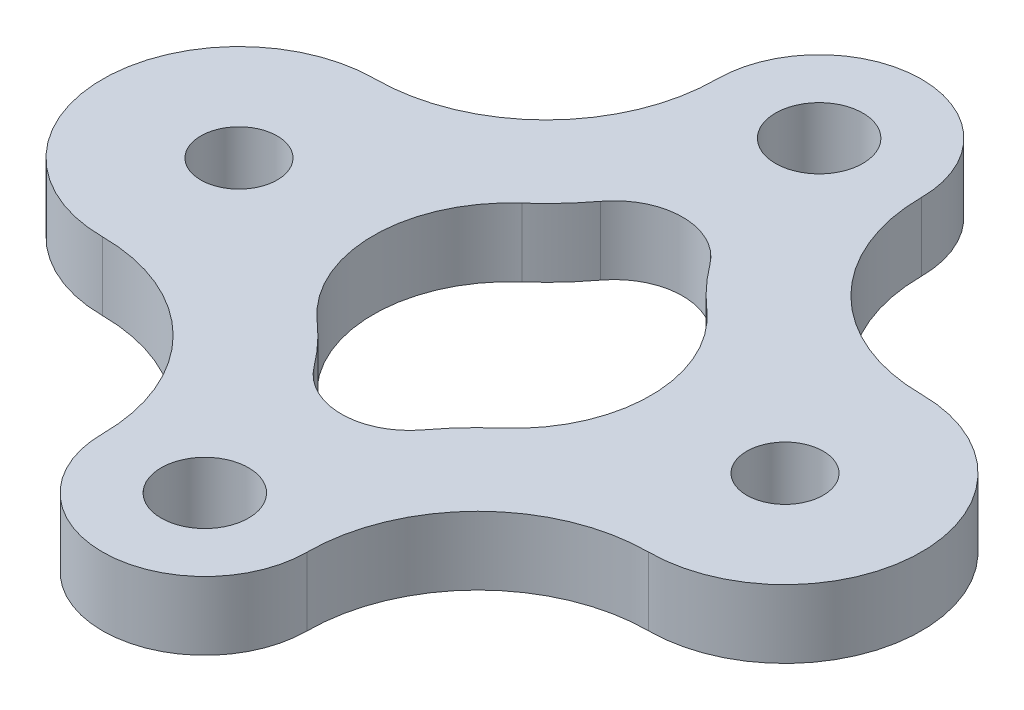
ISO-10303-21;
HEADER;
FILE_DESCRIPTION(('STEP AP214'),'2;1');
FILE_NAME('part.step','',(''),(''),'','','');
FILE_SCHEMA(('AUTOMOTIVE_DESIGN { 1 0 10303 214 1 1 1 1 }'));
ENDSEC;
DATA;
#1=APPLICATION_CONTEXT('core data for automotive mechanical design processes');
#2=APPLICATION_PROTOCOL_DEFINITION('international standard','automotive_design',2000,#1);
#3=PRODUCT_CONTEXT('',#1,'mechanical');
#4=PRODUCT('Part','Part','',(#3));
#5=PRODUCT_RELATED_PRODUCT_CATEGORY('part','',(#4));
#6=PRODUCT_DEFINITION_FORMATION('','',#4);
#7=PRODUCT_DEFINITION_CONTEXT('part definition',#1,'design');
#8=PRODUCT_DEFINITION('design','',#6,#7);
#9=PRODUCT_DEFINITION_SHAPE('','',#8);
#10=(LENGTH_UNIT() NAMED_UNIT(*) SI_UNIT(.MILLI.,.METRE.));
#11=(NAMED_UNIT(*) PLANE_ANGLE_UNIT() SI_UNIT($,.RADIAN.));
#12=(NAMED_UNIT(*) SI_UNIT($,.STERADIAN.) SOLID_ANGLE_UNIT());
#13=UNCERTAINTY_MEASURE_WITH_UNIT(LENGTH_MEASURE(1.E-05),#10,'distance_accuracy_value','');
#14=(GEOMETRIC_REPRESENTATION_CONTEXT(3) GLOBAL_UNCERTAINTY_ASSIGNED_CONTEXT((#13)) GLOBAL_UNIT_ASSIGNED_CONTEXT((#10,
#11,#12)) REPRESENTATION_CONTEXT('',''));
#15=CARTESIAN_POINT('',(0.,0.,0.));
#16=DIRECTION('',(0.,0.,1.));
#17=DIRECTION('',(1.,0.,0.));
#18=AXIS2_PLACEMENT_3D('',#15,#16,#17);
#19=CARTESIAN_POINT('',(-12.7,3.175254,4.76250000000004));
#20=DIRECTION('',(0.,-1.,0.));
#21=DIRECTION('',(0.,0.,-1.));
#22=AXIS2_PLACEMENT_3D('',#19,#20,#21);
#23=CYLINDRICAL_SURFACE('',#22,7.93750000000001);
#24=CARTESIAN_POINT('',(-12.7,0.,4.76250000000004));
#25=DIRECTION('',(0.,-1.,0.));
#26=DIRECTION('',(0.,0.,1.));
#27=AXIS2_PLACEMENT_3D('',#24,#25,#26);
#28=CIRCLE('',#27,7.93750000000001);
#29=CARTESIAN_POINT('',(-4.7625,0.,4.76250000000001));
#30=VERTEX_POINT('',#29);
#31=CARTESIAN_POINT('',(-12.7,0.,12.7));
#32=VERTEX_POINT('',#31);
#33=EDGE_CURVE('E263',#30,#32,#28,.T.);
#34=ORIENTED_EDGE('',*,*,#33,.T.);
#35=DIRECTION('',(0.,-1.,0.));
#36=VECTOR('',#35,1.);
#37=CARTESIAN_POINT('',(-12.7,3.175254,12.7));
#38=LINE('',#37,#36);
#39=CARTESIAN_POINT('',(-12.7,3.175254,12.7));
#40=VERTEX_POINT('',#39);
#41=EDGE_CURVE('E11',#40,#32,#38,.T.);
#42=ORIENTED_EDGE('',*,*,#41,.F.);
#43=CARTESIAN_POINT('',(-12.7,3.175254,4.76250000000004));
#44=DIRECTION('',(0.,-1.,0.));
#45=DIRECTION('',(0.,0.,1.));
#46=AXIS2_PLACEMENT_3D('',#43,#44,#45);
#47=CIRCLE('',#46,7.93750000000001);
#48=CARTESIAN_POINT('',(-4.7625,3.175254,4.76250000000001));
#49=VERTEX_POINT('',#48);
#50=EDGE_CURVE('E290',#49,#40,#47,.T.);
#51=ORIENTED_EDGE('',*,*,#50,.F.);
#52=DIRECTION('',(0.,-1.,0.));
#53=VECTOR('',#52,1.);
#54=CARTESIAN_POINT('',(-4.7625,3.175254,4.76250000000001));
#55=LINE('',#54,#53);
#56=EDGE_CURVE('E315',#49,#30,#55,.T.);
#57=ORIENTED_EDGE('',*,*,#56,.T.);
#58=EDGE_LOOP('',(#34,#42,#51,#57));
#59=FACE_BOUND('',#58,.T.);
#60=ADVANCED_FACE('F43',(#59),#23,.F.);
#61=CARTESIAN_POINT('',(-12.6999999999999,3.175254,19.05));
#62=DIRECTION('',(0.,-1.,0.));
#63=DIRECTION('',(0.,0.,-1.));
#64=AXIS2_PLACEMENT_3D('',#61,#62,#63);
#65=CYLINDRICAL_SURFACE('',#64,6.35);
#66=CARTESIAN_POINT('',(-12.6999999999999,0.,19.05));
#67=DIRECTION('',(0.,1.,0.));
#68=DIRECTION('',(0.,0.,1.));
#69=AXIS2_PLACEMENT_3D('',#66,#67,#68);
#70=CIRCLE('',#69,6.35);
#71=CARTESIAN_POINT('',(-12.6999999999999,0.,25.4));
#72=VERTEX_POINT('',#71);
#73=EDGE_CURVE('E319',#32,#72,#70,.T.);
#74=ORIENTED_EDGE('',*,*,#73,.T.);
#75=DIRECTION('',(0.,-1.,0.));
#76=VECTOR('',#75,1.);
#77=CARTESIAN_POINT('',(-12.6999999999999,3.175254,25.4));
#78=LINE('',#77,#76);
#79=CARTESIAN_POINT('',(-12.6999999999999,3.175254,25.4));
#80=VERTEX_POINT('',#79);
#81=EDGE_CURVE('E51',#80,#72,#78,.T.);
#82=ORIENTED_EDGE('',*,*,#81,.F.);
#83=CARTESIAN_POINT('',(-12.6999999999999,3.175254,19.05));
#84=DIRECTION('',(0.,1.,0.));
#85=DIRECTION('',(0.,0.,1.));
#86=AXIS2_PLACEMENT_3D('',#83,#84,#85);
#87=CIRCLE('',#86,6.35);
#88=EDGE_CURVE('E294',#40,#80,#87,.T.);
#89=ORIENTED_EDGE('',*,*,#88,.F.);
#90=ORIENTED_EDGE('',*,*,#41,.T.);
#91=EDGE_LOOP('',(#74,#82,#89,#90));
#92=FACE_BOUND('',#91,.T.);
#93=ADVANCED_FACE('F386',(#92),#65,.T.);
#94=CARTESIAN_POINT('',(-12.7,3.175254,33.3375));
#95=DIRECTION('',(0.,-1.,0.));
#96=DIRECTION('',(0.,0.,-1.));
#97=AXIS2_PLACEMENT_3D('',#94,#95,#96);
#98=CYLINDRICAL_SURFACE('',#97,7.93750000000001);
#99=CARTESIAN_POINT('',(-12.7,0.,33.3375));
#100=DIRECTION('',(0.,-1.,0.));
#101=DIRECTION('',(0.,0.,-1.));
#102=AXIS2_PLACEMENT_3D('',#99,#100,#101);
#103=CIRCLE('',#102,7.93750000000001);
#104=CARTESIAN_POINT('',(-4.7625,0.,33.3375));
#105=VERTEX_POINT('',#104);
#106=EDGE_CURVE('E322',#72,#105,#103,.T.);
#107=ORIENTED_EDGE('',*,*,#106,.T.);
#108=DIRECTION('',(0.,-1.,0.));
#109=VECTOR('',#108,1.);
#110=CARTESIAN_POINT('',(-4.7625,3.175254,33.3375));
#111=LINE('',#110,#109);
#112=CARTESIAN_POINT('',(-4.7625,3.175254,33.3375));
#113=VERTEX_POINT('',#112);
#114=EDGE_CURVE('E355',#113,#105,#111,.T.);
#115=ORIENTED_EDGE('',*,*,#114,.F.);
#116=CARTESIAN_POINT('',(-12.7,3.175254,33.3375));
#117=DIRECTION('',(0.,-1.,0.));
#118=DIRECTION('',(0.,0.,-1.));
#119=AXIS2_PLACEMENT_3D('',#116,#117,#118);
#120=CIRCLE('',#119,7.93750000000001);
#121=EDGE_CURVE('E298',#80,#113,#120,.T.);
#122=ORIENTED_EDGE('',*,*,#121,.F.);
#123=ORIENTED_EDGE('',*,*,#81,.T.);
#124=EDGE_LOOP('',(#107,#115,#122,#123));
#125=FACE_BOUND('',#124,.T.);
#126=ADVANCED_FACE('F364',(#125),#98,.F.);
#127=CARTESIAN_POINT('',(0.,3.175254,33.3375));
#128=DIRECTION('',(0.,-1.,0.));
#129=DIRECTION('',(0.,0.,-1.));
#130=AXIS2_PLACEMENT_3D('',#127,#128,#129);
#131=CYLINDRICAL_SURFACE('',#130,4.7625);
#132=CARTESIAN_POINT('',(0.,0.,33.3375));
#133=DIRECTION('',(0.,1.,0.));
#134=DIRECTION('',(0.,0.,1.));
#135=AXIS2_PLACEMENT_3D('',#132,#133,#134);
#136=CIRCLE('',#135,4.7625);
#137=CARTESIAN_POINT('',(4.7625,0.,33.3375));
#138=VERTEX_POINT('',#137);
#139=EDGE_CURVE('E325',#105,#138,#136,.T.);
#140=ORIENTED_EDGE('',*,*,#139,.T.);
#141=DIRECTION('',(0.,-1.,0.));
#142=VECTOR('',#141,1.);
#143=CARTESIAN_POINT('',(4.7625,3.175254,33.3375));
#144=LINE('',#143,#142);
#145=CARTESIAN_POINT('',(4.7625,3.175254,33.3375));
#146=VERTEX_POINT('',#145);
#147=EDGE_CURVE('E351',#146,#138,#144,.T.);
#148=ORIENTED_EDGE('',*,*,#147,.F.);
#149=CARTESIAN_POINT('',(0.,3.175254,33.3375));
#150=DIRECTION('',(0.,1.,0.));
#151=DIRECTION('',(0.,0.,1.));
#152=AXIS2_PLACEMENT_3D('',#149,#150,#151);
#153=CIRCLE('',#152,4.7625);
#154=EDGE_CURVE('E301',#113,#146,#153,.T.);
#155=ORIENTED_EDGE('',*,*,#154,.F.);
#156=ORIENTED_EDGE('',*,*,#114,.T.);
#157=EDGE_LOOP('',(#140,#148,#155,#156));
#158=FACE_BOUND('',#157,.T.);
#159=ADVANCED_FACE('F374',(#158),#131,.T.);
#160=CARTESIAN_POINT('',(12.7,3.175254,33.3375));
#161=DIRECTION('',(0.,-1.,0.));
#162=DIRECTION('',(0.,0.,-1.));
#163=AXIS2_PLACEMENT_3D('',#160,#161,#162);
#164=CYLINDRICAL_SURFACE('',#163,7.93750000000001);
#165=CARTESIAN_POINT('',(12.7,0.,33.3375));
#166=DIRECTION('',(0.,-1.,0.));
#167=DIRECTION('',(0.,0.,-1.));
#168=AXIS2_PLACEMENT_3D('',#165,#166,#167);
#169=CIRCLE('',#168,7.93750000000001);
#170=CARTESIAN_POINT('',(12.7,0.,25.4));
#171=VERTEX_POINT('',#170);
#172=EDGE_CURVE('E328',#138,#171,#169,.T.);
#173=ORIENTED_EDGE('',*,*,#172,.T.);
#174=DIRECTION('',(0.,-1.,0.));
#175=VECTOR('',#174,1.);
#176=CARTESIAN_POINT('',(12.7,3.175254,25.4));
#177=LINE('',#176,#175);
#178=CARTESIAN_POINT('',(12.7,3.175254,25.4));
#179=VERTEX_POINT('',#178);
#180=EDGE_CURVE('E347',#179,#171,#177,.T.);
#181=ORIENTED_EDGE('',*,*,#180,.F.);
#182=CARTESIAN_POINT('',(12.7,3.175254,33.3375));
#183=DIRECTION('',(0.,-1.,0.));
#184=DIRECTION('',(0.,0.,-1.));
#185=AXIS2_PLACEMENT_3D('',#182,#183,#184);
#186=CIRCLE('',#185,7.93750000000001);
#187=EDGE_CURVE('E304',#146,#179,#186,.T.);
#188=ORIENTED_EDGE('',*,*,#187,.F.);
#189=ORIENTED_EDGE('',*,*,#147,.T.);
#190=EDGE_LOOP('',(#173,#181,#188,#189));
#191=FACE_BOUND('',#190,.T.);
#192=ADVANCED_FACE('F378',(#191),#164,.F.);
#193=CARTESIAN_POINT('',(12.7,3.175254,19.05));
#194=DIRECTION('',(0.,-1.,0.));
#195=DIRECTION('',(0.,0.,-1.));
#196=AXIS2_PLACEMENT_3D('',#193,#194,#195);
#197=CYLINDRICAL_SURFACE('',#196,6.35);
#198=CARTESIAN_POINT('',(12.7,0.,19.05));
#199=DIRECTION('',(0.,1.,0.));
#200=DIRECTION('',(0.,0.,-1.));
#201=AXIS2_PLACEMENT_3D('',#198,#199,#200);
#202=CIRCLE('',#201,6.35);
#203=CARTESIAN_POINT('',(12.7,0.,12.7));
#204=VERTEX_POINT('',#203);
#205=EDGE_CURVE('E331',#171,#204,#202,.T.);
#206=ORIENTED_EDGE('',*,*,#205,.T.);
#207=DIRECTION('',(0.,-1.,0.));
#208=VECTOR('',#207,1.);
#209=CARTESIAN_POINT('',(12.7,3.175254,12.7));
#210=LINE('',#209,#208);
#211=CARTESIAN_POINT('',(12.7,3.175254,12.7));
#212=VERTEX_POINT('',#211);
#213=EDGE_CURVE('E344',#212,#204,#210,.T.);
#214=ORIENTED_EDGE('',*,*,#213,.F.);
#215=CARTESIAN_POINT('',(12.7,3.175254,19.05));
#216=DIRECTION('',(0.,1.,0.));
#217=DIRECTION('',(0.,0.,-1.));
#218=AXIS2_PLACEMENT_3D('',#215,#216,#217);
#219=CIRCLE('',#218,6.35);
#220=EDGE_CURVE('E307',#179,#212,#219,.T.);
#221=ORIENTED_EDGE('',*,*,#220,.F.);
#222=ORIENTED_EDGE('',*,*,#180,.T.);
#223=EDGE_LOOP('',(#206,#214,#221,#222));
#224=FACE_BOUND('',#223,.T.);
#225=ADVANCED_FACE('F399',(#224),#197,.T.);
#226=CARTESIAN_POINT('',(12.7,3.175254,4.76249999999999));
#227=DIRECTION('',(0.,-1.,0.));
#228=DIRECTION('',(0.,0.,-1.));
#229=AXIS2_PLACEMENT_3D('',#226,#227,#228);
#230=CYLINDRICAL_SURFACE('',#229,7.93750000000001);
#231=CARTESIAN_POINT('',(12.7,0.,4.76249999999999));
#232=DIRECTION('',(0.,-1.,0.));
#233=DIRECTION('',(0.,0.,1.));
#234=AXIS2_PLACEMENT_3D('',#231,#232,#233);
#235=CIRCLE('',#234,7.93750000000001);
#236=CARTESIAN_POINT('',(4.7625,0.,4.76249999999999));
#237=VERTEX_POINT('',#236);
#238=EDGE_CURVE('E334',#204,#237,#235,.T.);
#239=ORIENTED_EDGE('',*,*,#238,.T.);
#240=DIRECTION('',(0.,-1.,0.));
#241=VECTOR('',#240,1.);
#242=CARTESIAN_POINT('',(4.7625,3.175254,4.76249999999999));
#243=LINE('',#242,#241);
#244=CARTESIAN_POINT('',(4.7625,3.175254,4.76249999999999));
#245=VERTEX_POINT('',#244);
#246=EDGE_CURVE('E341',#245,#237,#243,.T.);
#247=ORIENTED_EDGE('',*,*,#246,.F.);
#248=CARTESIAN_POINT('',(12.7,3.175254,4.76249999999999));
#249=DIRECTION('',(0.,-1.,0.));
#250=DIRECTION('',(0.,0.,1.));
#251=AXIS2_PLACEMENT_3D('',#248,#249,#250);
#252=CIRCLE('',#251,7.93750000000001);
#253=EDGE_CURVE('E310',#212,#245,#252,.T.);
#254=ORIENTED_EDGE('',*,*,#253,.F.);
#255=ORIENTED_EDGE('',*,*,#213,.T.);
#256=EDGE_LOOP('',(#239,#247,#254,#255));
#257=FACE_BOUND('',#256,.T.);
#258=ADVANCED_FACE('F397',(#257),#230,.F.);
#259=CARTESIAN_POINT('',(0.,3.175254,4.7625));
#260=DIRECTION('',(0.,-1.,0.));
#261=DIRECTION('',(0.,0.,-1.));
#262=AXIS2_PLACEMENT_3D('',#259,#260,#261);
#263=CYLINDRICAL_SURFACE('',#262,4.7625);
#264=CARTESIAN_POINT('',(0.,0.,4.7625));
#265=DIRECTION('',(0.,1.,0.));
#266=DIRECTION('',(0.,0.,1.));
#267=AXIS2_PLACEMENT_3D('',#264,#265,#266);
#268=CIRCLE('',#267,4.7625);
#269=EDGE_CURVE('E295',#237,#30,#268,.T.);
#270=ORIENTED_EDGE('',*,*,#269,.T.);
#271=ORIENTED_EDGE('',*,*,#56,.F.);
#272=CARTESIAN_POINT('',(0.,3.175254,4.7625));
#273=DIRECTION('',(0.,1.,0.));
#274=DIRECTION('',(0.,0.,1.));
#275=AXIS2_PLACEMENT_3D('',#272,#273,#274);
#276=CIRCLE('',#275,4.7625);
#277=EDGE_CURVE('E312',#245,#49,#276,.T.);
#278=ORIENTED_EDGE('',*,*,#277,.F.);
#279=ORIENTED_EDGE('',*,*,#246,.T.);
#280=EDGE_LOOP('',(#270,#271,#278,#279));
#281=FACE_BOUND('',#280,.T.);
#282=ADVANCED_FACE('F392',(#281),#263,.T.);
#283=CARTESIAN_POINT('',(-6.35,3.175254,4.76250000000002));
#284=DIRECTION('',(0.,1.,0.));
#285=DIRECTION('',(0.,0.,1.));
#286=AXIS2_PLACEMENT_3D('',#283,#284,#285);
#287=PLANE('',#286);
#288=CARTESIAN_POINT('',(-12.7,3.175254,4.76250000000004));
#289=DIRECTION('',(0.,-1.,0.));
#290=DIRECTION('',(0.,0.,1.));
#291=AXIS2_PLACEMENT_3D('',#288,#289,#290);
#292=CIRCLE('',#291,12.7);
#293=CARTESIAN_POINT('',(-2.53999999999999,3.175254,12.3825));
#294=VERTEX_POINT('',#293);
#295=CARTESIAN_POINT('',(-4.29973958736993,3.175254,14.2875));
#296=VERTEX_POINT('',#295);
#297=EDGE_CURVE('E58',#294,#296,#292,.T.);
#298=ORIENTED_EDGE('',*,*,#297,.F.);
#299=CARTESIAN_POINT('',(0.,3.175254,14.2875));
#300=DIRECTION('',(0.,1.,0.));
#301=DIRECTION('',(0.,0.,-1.));
#302=AXIS2_PLACEMENT_3D('',#299,#300,#301);
#303=CIRCLE('',#302,3.175);
#304=CARTESIAN_POINT('',(2.54000000000001,3.175254,12.3825));
#305=VERTEX_POINT('',#304);
#306=EDGE_CURVE('E196',#305,#294,#303,.T.);
#307=ORIENTED_EDGE('',*,*,#306,.F.);
#308=CARTESIAN_POINT('',(12.7,3.175254,4.76249999999999));
#309=DIRECTION('',(0.,-1.,0.));
#310=DIRECTION('',(0.,0.,1.));
#311=AXIS2_PLACEMENT_3D('',#308,#309,#310);
#312=CIRCLE('',#311,12.7);
#313=CARTESIAN_POINT('',(4.29973958736993,3.175254,14.2875));
#314=VERTEX_POINT('',#313);
#315=EDGE_CURVE('E199',#314,#305,#312,.T.);
#316=ORIENTED_EDGE('',*,*,#315,.F.);
#317=CARTESIAN_POINT('',(0.0996093810548965,3.175254,19.05));
#318=DIRECTION('',(0.,1.,0.));
#319=DIRECTION('',(0.,0.,-1.));
#320=AXIS2_PLACEMENT_3D('',#317,#318,#319);
#321=CIRCLE('',#320,6.35);
#322=CARTESIAN_POINT('',(4.29973958736993,3.175254,23.8125));
#323=VERTEX_POINT('',#322);
#324=EDGE_CURVE('E235',#323,#314,#321,.T.);
#325=ORIENTED_EDGE('',*,*,#324,.F.);
#326=CARTESIAN_POINT('',(12.7,3.175254,33.3375));
#327=DIRECTION('',(0.,-1.,0.));
#328=DIRECTION('',(0.,0.,1.));
#329=AXIS2_PLACEMENT_3D('',#326,#327,#328);
#330=CIRCLE('',#329,12.7);
#331=CARTESIAN_POINT('',(2.53999999999999,3.175254,25.7175));
#332=VERTEX_POINT('',#331);
#333=EDGE_CURVE('E231',#332,#323,#330,.T.);
#334=ORIENTED_EDGE('',*,*,#333,.F.);
#335=CARTESIAN_POINT('',(0.,3.175254,23.8125));
#336=DIRECTION('',(0.,1.,0.));
#337=DIRECTION('',(0.,0.,1.));
#338=AXIS2_PLACEMENT_3D('',#335,#336,#337);
#339=CIRCLE('',#338,3.175);
#340=CARTESIAN_POINT('',(-2.54000000000001,3.175254,25.7175));
#341=VERTEX_POINT('',#340);
#342=EDGE_CURVE('E227',#341,#332,#339,.T.);
#343=ORIENTED_EDGE('',*,*,#342,.F.);
#344=CARTESIAN_POINT('',(-12.7,3.175254,33.3375));
#345=DIRECTION('',(0.,-1.,0.));
#346=DIRECTION('',(0.,0.,1.));
#347=AXIS2_PLACEMENT_3D('',#344,#345,#346);
#348=CIRCLE('',#347,12.7);
#349=CARTESIAN_POINT('',(-4.29973958736993,3.175254,23.8125));
#350=VERTEX_POINT('',#349);
#351=EDGE_CURVE('E223',#350,#341,#348,.T.);
#352=ORIENTED_EDGE('',*,*,#351,.F.);
#353=CARTESIAN_POINT('',(-0.0996093810548895,3.175254,19.05));
#354=DIRECTION('',(0.,1.,0.));
#355=DIRECTION('',(0.,0.,1.));
#356=AXIS2_PLACEMENT_3D('',#353,#354,#355);
#357=CIRCLE('',#356,6.35);
#358=EDGE_CURVE('E220',#296,#350,#357,.T.);
#359=ORIENTED_EDGE('',*,*,#358,.F.);
#360=EDGE_LOOP('',(#298,#307,#316,#325,#334,#343,#352,#359));
#361=FACE_BOUND('',#360,.T.);
#362=CARTESIAN_POINT('',(0.,3.175254,4.7625));
#363=DIRECTION('',(0.,1.,0.));
#364=DIRECTION('',(0.,0.,1.));
#365=AXIS2_PLACEMENT_3D('',#362,#363,#364);
#366=CIRCLE('',#365,2.032);
#367=CARTESIAN_POINT('',(0.,3.175254,6.7945));
#368=VERTEX_POINT('',#367);
#369=EDGE_CURVE('E264',#368,#368,#366,.T.);
#370=ORIENTED_EDGE('',*,*,#369,.F.);
#371=EDGE_LOOP('',(#370));
#372=FACE_BOUND('',#371,.T.);
#373=CARTESIAN_POINT('',(12.7,3.175254,19.05));
#374=DIRECTION('',(0.,1.,0.));
#375=DIRECTION('',(0.,0.,1.));
#376=AXIS2_PLACEMENT_3D('',#373,#374,#375);
#377=CIRCLE('',#376,1.778);
#378=CARTESIAN_POINT('',(12.7,3.175254,20.828));
#379=VERTEX_POINT('',#378);
#380=EDGE_CURVE('E268',#379,#379,#377,.T.);
#381=ORIENTED_EDGE('',*,*,#380,.F.);
#382=EDGE_LOOP('',(#381));
#383=FACE_BOUND('',#382,.T.);
#384=CARTESIAN_POINT('',(0.,3.175254,33.3375));
#385=DIRECTION('',(0.,1.,0.));
#386=DIRECTION('',(0.,0.,1.));
#387=AXIS2_PLACEMENT_3D('',#384,#385,#386);
#388=CIRCLE('',#387,2.032);
#389=CARTESIAN_POINT('',(0.,3.175254,35.3695));
#390=VERTEX_POINT('',#389);
#391=EDGE_CURVE('E275',#390,#390,#388,.T.);
#392=ORIENTED_EDGE('',*,*,#391,.F.);
#393=EDGE_LOOP('',(#392));
#394=FACE_BOUND('',#393,.T.);
#395=CARTESIAN_POINT('',(-12.6999999999999,3.175254,19.05));
#396=DIRECTION('',(0.,1.,0.));
#397=DIRECTION('',(0.,0.,1.));
#398=AXIS2_PLACEMENT_3D('',#395,#396,#397);
#399=CIRCLE('',#398,1.778);
#400=CARTESIAN_POINT('',(-12.6999999999999,3.175254,20.828));
#401=VERTEX_POINT('',#400);
#402=EDGE_CURVE('E283',#401,#401,#399,.T.);
#403=ORIENTED_EDGE('',*,*,#402,.F.);
#404=EDGE_LOOP('',(#403));
#405=FACE_BOUND('',#404,.T.);
#406=ORIENTED_EDGE('',*,*,#50,.T.);
#407=ORIENTED_EDGE('',*,*,#88,.T.);
#408=ORIENTED_EDGE('',*,*,#121,.T.);
#409=ORIENTED_EDGE('',*,*,#154,.T.);
#410=ORIENTED_EDGE('',*,*,#187,.T.);
#411=ORIENTED_EDGE('',*,*,#220,.T.);
#412=ORIENTED_EDGE('',*,*,#253,.T.);
#413=ORIENTED_EDGE('',*,*,#277,.T.);
#414=EDGE_LOOP('',(#406,#407,#408,#409,#410,#411,#412,#413));
#415=FACE_BOUND('',#414,.T.);
#416=ADVANCED_FACE('F382',(#361,#372,#383,#394,#405,#415),#287,.T.);
#417=CARTESIAN_POINT('',(-6.35,0.,4.76250000000002));
#418=DIRECTION('',(0.,1.,0.));
#419=DIRECTION('',(0.,0.,1.));
#420=AXIS2_PLACEMENT_3D('',#417,#418,#419);
#421=PLANE('',#420);
#422=CARTESIAN_POINT('',(0.,0.,14.2875));
#423=DIRECTION('',(0.,1.,0.));
#424=DIRECTION('',(0.,0.,-1.));
#425=AXIS2_PLACEMENT_3D('',#422,#423,#424);
#426=CIRCLE('',#425,3.175);
#427=CARTESIAN_POINT('',(2.54000000000001,0.,12.3825));
#428=VERTEX_POINT('',#427);
#429=CARTESIAN_POINT('',(-2.53999999999999,0.,12.3825));
#430=VERTEX_POINT('',#429);
#431=EDGE_CURVE('E184',#428,#430,#426,.T.);
#432=ORIENTED_EDGE('',*,*,#431,.T.);
#433=CARTESIAN_POINT('',(-12.7,0.,4.76250000000004));
#434=DIRECTION('',(0.,-1.,0.));
#435=DIRECTION('',(0.,0.,1.));
#436=AXIS2_PLACEMENT_3D('',#433,#434,#435);
#437=CIRCLE('',#436,12.7);
#438=CARTESIAN_POINT('',(-4.29973958736993,0.,14.2875));
#439=VERTEX_POINT('',#438);
#440=EDGE_CURVE('E178',#430,#439,#437,.T.);
#441=ORIENTED_EDGE('',*,*,#440,.T.);
#442=CARTESIAN_POINT('',(-0.0996093810548895,0.,19.05));
#443=DIRECTION('',(0.,1.,0.));
#444=DIRECTION('',(0.,0.,1.));
#445=AXIS2_PLACEMENT_3D('',#442,#443,#444);
#446=CIRCLE('',#445,6.35);
#447=CARTESIAN_POINT('',(-4.29973958736993,0.,23.8125));
#448=VERTEX_POINT('',#447);
#449=EDGE_CURVE('E187',#439,#448,#446,.T.);
#450=ORIENTED_EDGE('',*,*,#449,.T.);
#451=CARTESIAN_POINT('',(-12.7,0.,33.3375));
#452=DIRECTION('',(0.,-1.,0.));
#453=DIRECTION('',(0.,0.,1.));
#454=AXIS2_PLACEMENT_3D('',#451,#452,#453);
#455=CIRCLE('',#454,12.7);
#456=CARTESIAN_POINT('',(-2.54000000000001,0.,25.7175));
#457=VERTEX_POINT('',#456);
#458=EDGE_CURVE('E69',#448,#457,#455,.T.);
#459=ORIENTED_EDGE('',*,*,#458,.T.);
#460=CARTESIAN_POINT('',(0.,0.,23.8125));
#461=DIRECTION('',(0.,1.,0.));
#462=DIRECTION('',(0.,0.,1.));
#463=AXIS2_PLACEMENT_3D('',#460,#461,#462);
#464=CIRCLE('',#463,3.175);
#465=CARTESIAN_POINT('',(2.53999999999999,0.,25.7175));
#466=VERTEX_POINT('',#465);
#467=EDGE_CURVE('E204',#457,#466,#464,.T.);
#468=ORIENTED_EDGE('',*,*,#467,.T.);
#469=CARTESIAN_POINT('',(12.7,0.,33.3375));
#470=DIRECTION('',(0.,-1.,0.));
#471=DIRECTION('',(0.,0.,1.));
#472=AXIS2_PLACEMENT_3D('',#469,#470,#471);
#473=CIRCLE('',#472,12.7);
#474=CARTESIAN_POINT('',(4.29973958736993,0.,23.8125));
#475=VERTEX_POINT('',#474);
#476=EDGE_CURVE('E208',#466,#475,#473,.T.);
#477=ORIENTED_EDGE('',*,*,#476,.T.);
#478=CARTESIAN_POINT('',(0.0996093810548965,0.,19.05));
#479=DIRECTION('',(0.,1.,0.));
#480=DIRECTION('',(0.,0.,-1.));
#481=AXIS2_PLACEMENT_3D('',#478,#479,#480);
#482=CIRCLE('',#481,6.35);
#483=CARTESIAN_POINT('',(4.29973958736993,0.,14.2875));
#484=VERTEX_POINT('',#483);
#485=EDGE_CURVE('E212',#475,#484,#482,.T.);
#486=ORIENTED_EDGE('',*,*,#485,.T.);
#487=CARTESIAN_POINT('',(12.7,0.,4.76249999999999));
#488=DIRECTION('',(0.,-1.,0.));
#489=DIRECTION('',(0.,0.,1.));
#490=AXIS2_PLACEMENT_3D('',#487,#488,#489);
#491=CIRCLE('',#490,12.7);
#492=EDGE_CURVE('E216',#484,#428,#491,.T.);
#493=ORIENTED_EDGE('',*,*,#492,.T.);
#494=EDGE_LOOP('',(#432,#441,#450,#459,#468,#477,#486,#493));
#495=FACE_BOUND('',#494,.T.);
#496=CARTESIAN_POINT('',(0.,0.,4.7625));
#497=DIRECTION('',(0.,1.,0.));
#498=DIRECTION('',(0.,0.,1.));
#499=AXIS2_PLACEMENT_3D('',#496,#497,#498);
#500=CIRCLE('',#499,2.032);
#501=CARTESIAN_POINT('',(0.,0.,6.7945));
#502=VERTEX_POINT('',#501);
#503=EDGE_CURVE('E259',#502,#502,#500,.T.);
#504=ORIENTED_EDGE('',*,*,#503,.T.);
#505=EDGE_LOOP('',(#504));
#506=FACE_BOUND('',#505,.T.);
#507=CARTESIAN_POINT('',(12.7,0.,19.05));
#508=DIRECTION('',(0.,1.,0.));
#509=DIRECTION('',(0.,0.,1.));
#510=AXIS2_PLACEMENT_3D('',#507,#508,#509);
#511=CIRCLE('',#510,1.778);
#512=CARTESIAN_POINT('',(12.7,0.,20.828));
#513=VERTEX_POINT('',#512);
#514=EDGE_CURVE('E271',#513,#513,#511,.T.);
#515=ORIENTED_EDGE('',*,*,#514,.T.);
#516=EDGE_LOOP('',(#515));
#517=FACE_BOUND('',#516,.T.);
#518=CARTESIAN_POINT('',(0.,0.,33.3375));
#519=DIRECTION('',(0.,1.,0.));
#520=DIRECTION('',(0.,0.,1.));
#521=AXIS2_PLACEMENT_3D('',#518,#519,#520);
#522=CIRCLE('',#521,2.032);
#523=CARTESIAN_POINT('',(0.,0.,35.3695));
#524=VERTEX_POINT('',#523);
#525=EDGE_CURVE('E279',#524,#524,#522,.T.);
#526=ORIENTED_EDGE('',*,*,#525,.T.);
#527=EDGE_LOOP('',(#526));
#528=FACE_BOUND('',#527,.T.);
#529=CARTESIAN_POINT('',(-12.6999999999999,0.,19.05));
#530=DIRECTION('',(0.,1.,0.));
#531=DIRECTION('',(0.,0.,1.));
#532=AXIS2_PLACEMENT_3D('',#529,#530,#531);
#533=CIRCLE('',#532,1.778);
#534=CARTESIAN_POINT('',(-12.6999999999999,0.,20.828));
#535=VERTEX_POINT('',#534);
#536=EDGE_CURVE('E243',#535,#535,#533,.T.);
#537=ORIENTED_EDGE('',*,*,#536,.T.);
#538=EDGE_LOOP('',(#537));
#539=FACE_BOUND('',#538,.T.);
#540=ORIENTED_EDGE('',*,*,#33,.F.);
#541=ORIENTED_EDGE('',*,*,#269,.F.);
#542=ORIENTED_EDGE('',*,*,#238,.F.);
#543=ORIENTED_EDGE('',*,*,#205,.F.);
#544=ORIENTED_EDGE('',*,*,#172,.F.);
#545=ORIENTED_EDGE('',*,*,#139,.F.);
#546=ORIENTED_EDGE('',*,*,#106,.F.);
#547=ORIENTED_EDGE('',*,*,#73,.F.);
#548=EDGE_LOOP('',(#540,#541,#542,#543,#544,#545,#546,#547));
#549=FACE_BOUND('',#548,.T.);
#550=ADVANCED_FACE('F192',(#495,#506,#517,#528,#539,#549),#421,.F.);
#551=CARTESIAN_POINT('',(-12.6999999999999,0.,19.05));
#552=DIRECTION('',(0.,1.,0.));
#553=DIRECTION('',(0.,0.,1.));
#554=AXIS2_PLACEMENT_3D('',#551,#552,#553);
#555=CYLINDRICAL_SURFACE('',#554,1.778);
#556=ORIENTED_EDGE('',*,*,#536,.F.);
#557=EDGE_LOOP('',(#556));
#558=FACE_BOUND('',#557,.T.);
#559=ORIENTED_EDGE('',*,*,#402,.T.);
#560=EDGE_LOOP('',(#559));
#561=FACE_BOUND('',#560,.T.);
#562=ADVANCED_FACE('F466',(#558,#561),#555,.F.);
#563=CARTESIAN_POINT('',(0.,0.,33.3375));
#564=DIRECTION('',(0.,1.,0.));
#565=DIRECTION('',(0.,0.,1.));
#566=AXIS2_PLACEMENT_3D('',#563,#564,#565);
#567=CYLINDRICAL_SURFACE('',#566,2.032);
#568=ORIENTED_EDGE('',*,*,#525,.F.);
#569=EDGE_LOOP('',(#568));
#570=FACE_BOUND('',#569,.T.);
#571=ORIENTED_EDGE('',*,*,#391,.T.);
#572=EDGE_LOOP('',(#571));
#573=FACE_BOUND('',#572,.T.);
#574=ADVANCED_FACE('F475',(#570,#573),#567,.F.);
#575=CARTESIAN_POINT('',(12.7,0.,19.05));
#576=DIRECTION('',(0.,1.,0.));
#577=DIRECTION('',(0.,0.,1.));
#578=AXIS2_PLACEMENT_3D('',#575,#576,#577);
#579=CYLINDRICAL_SURFACE('',#578,1.778);
#580=ORIENTED_EDGE('',*,*,#514,.F.);
#581=EDGE_LOOP('',(#580));
#582=FACE_BOUND('',#581,.T.);
#583=ORIENTED_EDGE('',*,*,#380,.T.);
#584=EDGE_LOOP('',(#583));
#585=FACE_BOUND('',#584,.T.);
#586=ADVANCED_FACE('F485',(#582,#585),#579,.F.);
#587=CARTESIAN_POINT('',(0.,0.,4.7625));
#588=DIRECTION('',(0.,1.,0.));
#589=DIRECTION('',(0.,0.,1.));
#590=AXIS2_PLACEMENT_3D('',#587,#588,#589);
#591=CYLINDRICAL_SURFACE('',#590,2.032);
#592=ORIENTED_EDGE('',*,*,#503,.F.);
#593=EDGE_LOOP('',(#592));
#594=FACE_BOUND('',#593,.T.);
#595=ORIENTED_EDGE('',*,*,#369,.T.);
#596=EDGE_LOOP('',(#595));
#597=FACE_BOUND('',#596,.T.);
#598=ADVANCED_FACE('F495',(#594,#597),#591,.F.);
#599=CARTESIAN_POINT('',(-12.7,0.,4.76250000000004));
#600=DIRECTION('',(0.,1.,0.));
#601=DIRECTION('',(0.,0.,1.));
#602=AXIS2_PLACEMENT_3D('',#599,#600,#601);
#603=CYLINDRICAL_SURFACE('',#602,12.7);
#604=ORIENTED_EDGE('',*,*,#297,.T.);
#605=DIRECTION('',(0.,1.,0.));
#606=VECTOR('',#605,1.);
#607=CARTESIAN_POINT('',(-4.29973958736993,0.,14.2875));
#608=LINE('',#607,#606);
#609=EDGE_CURVE('E174',#439,#296,#608,.T.);
#610=ORIENTED_EDGE('',*,*,#609,.F.);
#611=ORIENTED_EDGE('',*,*,#440,.F.);
#612=DIRECTION('',(0.,1.,0.));
#613=VECTOR('',#612,1.);
#614=CARTESIAN_POINT('',(-2.53999999999999,0.,12.3825));
#615=LINE('',#614,#613);
#616=EDGE_CURVE('E241',#430,#294,#615,.T.);
#617=ORIENTED_EDGE('',*,*,#616,.T.);
#618=EDGE_LOOP('',(#604,#610,#611,#617));
#619=FACE_BOUND('',#618,.T.);
#620=ADVANCED_FACE('F176',(#619),#603,.T.);
#621=CARTESIAN_POINT('',(0.,0.,14.2875));
#622=DIRECTION('',(0.,1.,0.));
#623=DIRECTION('',(0.,0.,1.));
#624=AXIS2_PLACEMENT_3D('',#621,#622,#623);
#625=CYLINDRICAL_SURFACE('',#624,3.175);
#626=ORIENTED_EDGE('',*,*,#306,.T.);
#627=ORIENTED_EDGE('',*,*,#616,.F.);
#628=ORIENTED_EDGE('',*,*,#431,.F.);
#629=DIRECTION('',(0.,1.,0.));
#630=VECTOR('',#629,1.);
#631=CARTESIAN_POINT('',(2.54000000000001,0.,12.3825));
#632=LINE('',#631,#630);
#633=EDGE_CURVE('E244',#428,#305,#632,.T.);
#634=ORIENTED_EDGE('',*,*,#633,.T.);
#635=EDGE_LOOP('',(#626,#627,#628,#634));
#636=FACE_BOUND('',#635,.T.);
#637=ADVANCED_FACE('F512',(#636),#625,.F.);
#638=CARTESIAN_POINT('',(12.7,0.,4.76249999999999));
#639=DIRECTION('',(0.,1.,0.));
#640=DIRECTION('',(0.,0.,1.));
#641=AXIS2_PLACEMENT_3D('',#638,#639,#640);
#642=CYLINDRICAL_SURFACE('',#641,12.7);
#643=ORIENTED_EDGE('',*,*,#315,.T.);
#644=ORIENTED_EDGE('',*,*,#633,.F.);
#645=ORIENTED_EDGE('',*,*,#492,.F.);
#646=DIRECTION('',(0.,1.,0.));
#647=VECTOR('',#646,1.);
#648=CARTESIAN_POINT('',(4.29973958736993,0.,14.2875));
#649=LINE('',#648,#647);
#650=EDGE_CURVE('E246',#484,#314,#649,.T.);
#651=ORIENTED_EDGE('',*,*,#650,.T.);
#652=EDGE_LOOP('',(#643,#644,#645,#651));
#653=FACE_BOUND('',#652,.T.);
#654=ADVANCED_FACE('F521',(#653),#642,.T.);
#655=CARTESIAN_POINT('',(0.0996093810548965,0.,19.05));
#656=DIRECTION('',(0.,1.,0.));
#657=DIRECTION('',(0.,0.,1.));
#658=AXIS2_PLACEMENT_3D('',#655,#656,#657);
#659=CYLINDRICAL_SURFACE('',#658,6.35);
#660=ORIENTED_EDGE('',*,*,#324,.T.);
#661=ORIENTED_EDGE('',*,*,#650,.F.);
#662=ORIENTED_EDGE('',*,*,#485,.F.);
#663=DIRECTION('',(0.,1.,0.));
#664=VECTOR('',#663,1.);
#665=CARTESIAN_POINT('',(4.29973958736993,0.,23.8125));
#666=LINE('',#665,#664);
#667=EDGE_CURVE('E248',#475,#323,#666,.T.);
#668=ORIENTED_EDGE('',*,*,#667,.T.);
#669=EDGE_LOOP('',(#660,#661,#662,#668));
#670=FACE_BOUND('',#669,.T.);
#671=ADVANCED_FACE('F531',(#670),#659,.F.);
#672=CARTESIAN_POINT('',(12.7,0.,33.3375));
#673=DIRECTION('',(0.,1.,0.));
#674=DIRECTION('',(0.,0.,1.));
#675=AXIS2_PLACEMENT_3D('',#672,#673,#674);
#676=CYLINDRICAL_SURFACE('',#675,12.7);
#677=ORIENTED_EDGE('',*,*,#333,.T.);
#678=ORIENTED_EDGE('',*,*,#667,.F.);
#679=ORIENTED_EDGE('',*,*,#476,.F.);
#680=DIRECTION('',(0.,1.,0.));
#681=VECTOR('',#680,1.);
#682=CARTESIAN_POINT('',(2.53999999999999,0.,25.7175));
#683=LINE('',#682,#681);
#684=EDGE_CURVE('E251',#466,#332,#683,.T.);
#685=ORIENTED_EDGE('',*,*,#684,.T.);
#686=EDGE_LOOP('',(#677,#678,#679,#685));
#687=FACE_BOUND('',#686,.T.);
#688=ADVANCED_FACE('F541',(#687),#676,.T.);
#689=CARTESIAN_POINT('',(0.,0.,23.8125));
#690=DIRECTION('',(0.,1.,0.));
#691=DIRECTION('',(0.,0.,1.));
#692=AXIS2_PLACEMENT_3D('',#689,#690,#691);
#693=CYLINDRICAL_SURFACE('',#692,3.175);
#694=ORIENTED_EDGE('',*,*,#342,.T.);
#695=ORIENTED_EDGE('',*,*,#684,.F.);
#696=ORIENTED_EDGE('',*,*,#467,.F.);
#697=DIRECTION('',(0.,1.,0.));
#698=VECTOR('',#697,1.);
#699=CARTESIAN_POINT('',(-2.54000000000001,0.,25.7175));
#700=LINE('',#699,#698);
#701=EDGE_CURVE('E254',#457,#341,#700,.T.);
#702=ORIENTED_EDGE('',*,*,#701,.T.);
#703=EDGE_LOOP('',(#694,#695,#696,#702));
#704=FACE_BOUND('',#703,.T.);
#705=ADVANCED_FACE('F551',(#704),#693,.F.);
#706=CARTESIAN_POINT('',(-12.7,0.,33.3375));
#707=DIRECTION('',(0.,1.,0.));
#708=DIRECTION('',(0.,0.,1.));
#709=AXIS2_PLACEMENT_3D('',#706,#707,#708);
#710=CYLINDRICAL_SURFACE('',#709,12.7);
#711=ORIENTED_EDGE('',*,*,#351,.T.);
#712=ORIENTED_EDGE('',*,*,#701,.F.);
#713=ORIENTED_EDGE('',*,*,#458,.F.);
#714=DIRECTION('',(0.,1.,0.));
#715=VECTOR('',#714,1.);
#716=CARTESIAN_POINT('',(-4.29973958736993,0.,23.8125));
#717=LINE('',#716,#715);
#718=EDGE_CURVE('E183',#448,#350,#717,.T.);
#719=ORIENTED_EDGE('',*,*,#718,.T.);
#720=EDGE_LOOP('',(#711,#712,#713,#719));
#721=FACE_BOUND('',#720,.T.);
#722=ADVANCED_FACE('F561',(#721),#710,.T.);
#723=CARTESIAN_POINT('',(-0.0996093810548895,0.,19.05));
#724=DIRECTION('',(0.,1.,0.));
#725=DIRECTION('',(0.,0.,1.));
#726=AXIS2_PLACEMENT_3D('',#723,#724,#725);
#727=CYLINDRICAL_SURFACE('',#726,6.35);
#728=ORIENTED_EDGE('',*,*,#358,.T.);
#729=ORIENTED_EDGE('',*,*,#718,.F.);
#730=ORIENTED_EDGE('',*,*,#449,.F.);
#731=ORIENTED_EDGE('',*,*,#609,.T.);
#732=EDGE_LOOP('',(#728,#729,#730,#731));
#733=FACE_BOUND('',#732,.T.);
#734=ADVANCED_FACE('F188',(#733),#727,.F.);
#735=CLOSED_SHELL('',(#60,#93,#126,#159,#192,#225,#258,#282,#416,#550,#562,#574,#586,#598,#620,
#637,#654,#671,#688,#705,#722,#734));
#736=MANIFOLD_SOLID_BREP('B2',#735);
#737=ADVANCED_BREP_SHAPE_REPRESENTATION('',(#18,#736),#14);
#738=SHAPE_DEFINITION_REPRESENTATION(#9,#737);
ENDSEC;
END-ISO-10303-21;
